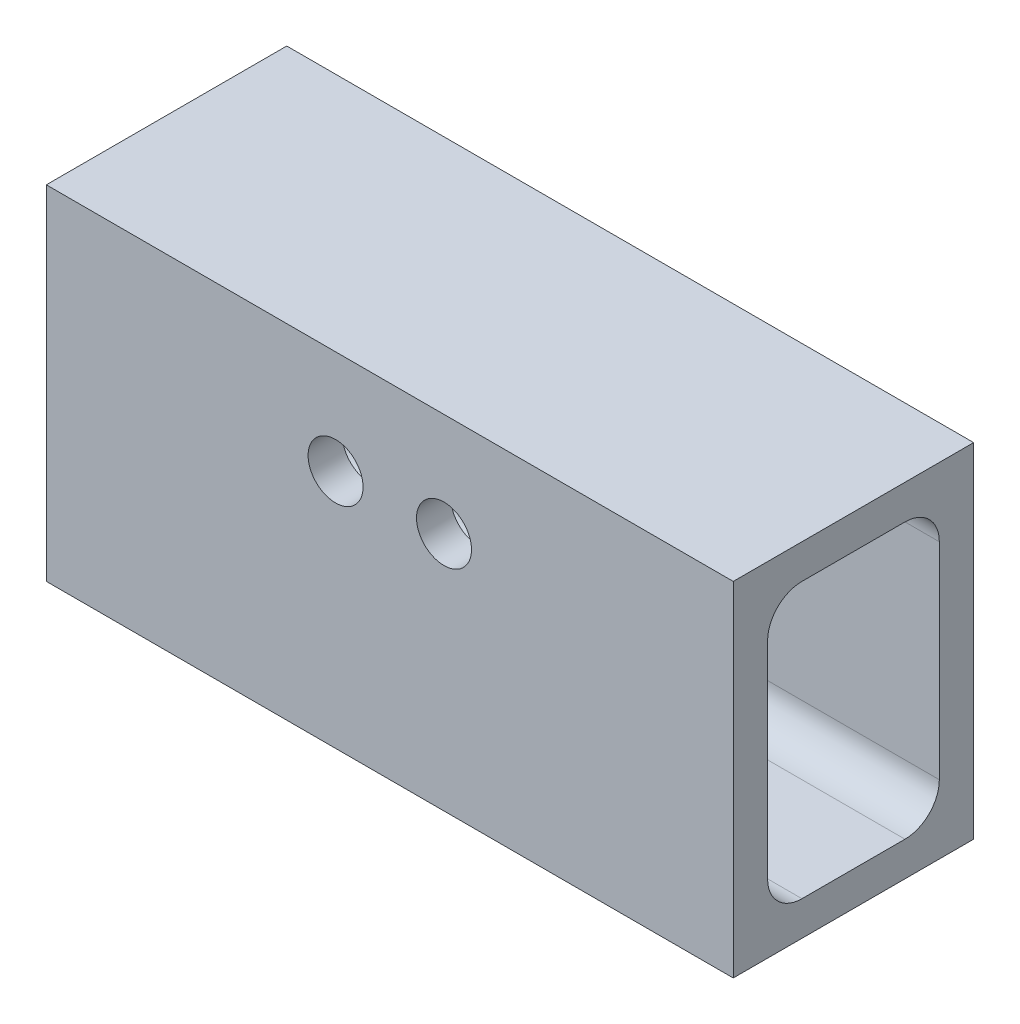
ISO-10303-21;
HEADER;
FILE_DESCRIPTION(('STEP AP214'),'2;1');
FILE_NAME('part.step','',(''),(''),'','','');
FILE_SCHEMA(('AUTOMOTIVE_DESIGN { 1 0 10303 214 1 1 1 1 }'));
ENDSEC;
DATA;
#1=APPLICATION_CONTEXT('core data for automotive mechanical design processes');
#2=APPLICATION_PROTOCOL_DEFINITION('international standard','automotive_design',2000,#1);
#3=PRODUCT_CONTEXT('',#1,'mechanical');
#4=PRODUCT('Part','Part','',(#3));
#5=PRODUCT_RELATED_PRODUCT_CATEGORY('part','',(#4));
#6=PRODUCT_DEFINITION_FORMATION('','',#4);
#7=PRODUCT_DEFINITION_CONTEXT('part definition',#1,'design');
#8=PRODUCT_DEFINITION('design','',#6,#7);
#9=PRODUCT_DEFINITION_SHAPE('','',#8);
#10=(LENGTH_UNIT() NAMED_UNIT(*) SI_UNIT(.MILLI.,.METRE.));
#11=(NAMED_UNIT(*) PLANE_ANGLE_UNIT() SI_UNIT($,.RADIAN.));
#12=(NAMED_UNIT(*) SI_UNIT($,.STERADIAN.) SOLID_ANGLE_UNIT());
#13=UNCERTAINTY_MEASURE_WITH_UNIT(LENGTH_MEASURE(1.E-05),#10,'distance_accuracy_value','');
#14=(GEOMETRIC_REPRESENTATION_CONTEXT(3) GLOBAL_UNCERTAINTY_ASSIGNED_CONTEXT((#13)) GLOBAL_UNIT_ASSIGNED_CONTEXT((#10,
#11,#12)) REPRESENTATION_CONTEXT('',''));
#15=CARTESIAN_POINT('',(0.,0.,0.));
#16=DIRECTION('',(0.,0.,1.));
#17=DIRECTION('',(1.,0.,0.));
#18=AXIS2_PLACEMENT_3D('',#15,#16,#17);
#19=CARTESIAN_POINT('',(9.84311629413669,0.0508823875396415,18.5412850449169));
#20=DIRECTION('',(1.,0.,0.));
#21=DIRECTION('',(0.,1.,0.));
#22=AXIS2_PLACEMENT_3D('',#19,#20,#21);
#23=CYLINDRICAL_SURFACE('',#22,0.75);
#24=DIRECTION('',(-1.,0.,0.));
#25=VECTOR('',#24,1.);
#26=CARTESIAN_POINT('',(9.84311629413669,0.0508823875396415,19.2912850449169));
#27=LINE('',#26,#25);
#28=CARTESIAN_POINT('',(9.84311629413669,0.0508823875396415,19.2912850449169));
#29=VERTEX_POINT('',#28);
#30=CARTESIAN_POINT('',(-5.15688370586331,0.0508823875396394,19.2912850449169));
#31=VERTEX_POINT('',#30);
#32=EDGE_CURVE('E184',#29,#31,#27,.T.);
#33=ORIENTED_EDGE('',*,*,#32,.F.);
#34=CARTESIAN_POINT('',(9.84311629413668,0.0508823875396415,18.5412850449169));
#35=DIRECTION('',(-1.,0.,0.));
#36=DIRECTION('',(0.,-1.,0.));
#37=AXIS2_PLACEMENT_3D('',#34,#35,#36);
#38=CIRCLE('',#37,0.75);
#39=CARTESIAN_POINT('',(9.84311629413669,-0.699117612460358,18.5412850449169));
#40=VERTEX_POINT('',#39);
#41=EDGE_CURVE('E43',#29,#40,#38,.F.);
#42=ORIENTED_EDGE('',*,*,#41,.T.);
#43=DIRECTION('',(-1.,0.,0.));
#44=VECTOR('',#43,1.);
#45=CARTESIAN_POINT('',(9.84311629413669,-0.699117612460358,18.5412850449169));
#46=LINE('',#45,#44);
#47=CARTESIAN_POINT('',(-5.15688370586331,-0.69911761246036,18.5412850449169));
#48=VERTEX_POINT('',#47);
#49=EDGE_CURVE('E187',#48,#40,#46,.F.);
#50=ORIENTED_EDGE('',*,*,#49,.F.);
#51=CARTESIAN_POINT('',(-5.15688370586331,0.0508823875396394,18.5412850449169));
#52=DIRECTION('',(1.,0.,0.));
#53=DIRECTION('',(0.,1.,0.));
#54=AXIS2_PLACEMENT_3D('',#51,#52,#53);
#55=CIRCLE('',#54,0.75);
#56=EDGE_CURVE('E11',#48,#31,#55,.F.);
#57=ORIENTED_EDGE('',*,*,#56,.T.);
#58=EDGE_LOOP('',(#33,#42,#50,#57));
#59=FACE_BOUND('',#58,.T.);
#60=ADVANCED_FACE('F36',(#59),#23,.F.);
#61=CARTESIAN_POINT('',(9.84311629413669,0.0508823875396415,16.2912850449169));
#62=DIRECTION('',(-1.,0.,0.));
#63=DIRECTION('',(0.,-1.,0.));
#64=AXIS2_PLACEMENT_3D('',#61,#62,#63);
#65=CYLINDRICAL_SURFACE('',#64,0.75);
#66=DIRECTION('',(1.,0.,0.));
#67=VECTOR('',#66,1.);
#68=CARTESIAN_POINT('',(9.84311629413669,0.0508823875396415,15.5412850449169));
#69=LINE('',#68,#67);
#70=CARTESIAN_POINT('',(-5.15688370586331,0.0508823875396394,15.5412850449169));
#71=VERTEX_POINT('',#70);
#72=CARTESIAN_POINT('',(9.84311629413669,0.0508823875396415,15.5412850449169));
#73=VERTEX_POINT('',#72);
#74=EDGE_CURVE('E174',#71,#73,#69,.T.);
#75=ORIENTED_EDGE('',*,*,#74,.F.);
#76=CARTESIAN_POINT('',(-5.15688370586331,0.0508823875396394,16.2912850449169));
#77=DIRECTION('',(1.,0.,0.));
#78=DIRECTION('',(0.,1.,0.));
#79=AXIS2_PLACEMENT_3D('',#76,#77,#78);
#80=CIRCLE('',#79,0.75);
#81=CARTESIAN_POINT('',(-5.15688370586331,-0.69911761246036,16.2912850449169));
#82=VERTEX_POINT('',#81);
#83=EDGE_CURVE('E180',#71,#82,#80,.F.);
#84=ORIENTED_EDGE('',*,*,#83,.T.);
#85=DIRECTION('',(1.,0.,0.));
#86=VECTOR('',#85,1.);
#87=CARTESIAN_POINT('',(9.84311629413669,-0.699117612460358,16.2912850449169));
#88=LINE('',#87,#86);
#89=CARTESIAN_POINT('',(9.84311629413669,-0.699117612460358,16.2912850449169));
#90=VERTEX_POINT('',#89);
#91=EDGE_CURVE('E177',#90,#82,#88,.F.);
#92=ORIENTED_EDGE('',*,*,#91,.F.);
#93=CARTESIAN_POINT('',(9.84311629413668,0.0508823875396415,16.2912850449169));
#94=DIRECTION('',(-1.,0.,0.));
#95=DIRECTION('',(0.,-1.,0.));
#96=AXIS2_PLACEMENT_3D('',#93,#94,#95);
#97=CIRCLE('',#96,0.75);
#98=EDGE_CURVE('E182',#90,#73,#97,.F.);
#99=ORIENTED_EDGE('',*,*,#98,.T.);
#100=EDGE_LOOP('',(#75,#84,#92,#99));
#101=FACE_BOUND('',#100,.T.);
#102=ADVANCED_FACE('F246',(#101),#65,.F.);
#103=CARTESIAN_POINT('',(9.84311629413669,4.55088238753964,18.5412850449169));
#104=DIRECTION('',(1.,0.,0.));
#105=DIRECTION('',(0.,1.,0.));
#106=AXIS2_PLACEMENT_3D('',#103,#104,#105);
#107=CYLINDRICAL_SURFACE('',#106,0.75);
#108=DIRECTION('',(-1.,0.,0.));
#109=VECTOR('',#108,1.);
#110=CARTESIAN_POINT('',(9.84311629413669,5.30088238753964,18.5412850449169));
#111=LINE('',#110,#109);
#112=CARTESIAN_POINT('',(9.84311629413669,5.30088238753964,18.5412850449169));
#113=VERTEX_POINT('',#112);
#114=CARTESIAN_POINT('',(-5.15688370586331,5.30088238753964,18.5412850449169));
#115=VERTEX_POINT('',#114);
#116=EDGE_CURVE('E163',#113,#115,#111,.T.);
#117=ORIENTED_EDGE('',*,*,#116,.F.);
#118=CARTESIAN_POINT('',(9.84311629413669,4.55088238753964,18.5412850449169));
#119=DIRECTION('',(-1.,0.,0.));
#120=DIRECTION('',(0.,-1.,0.));
#121=AXIS2_PLACEMENT_3D('',#118,#119,#120);
#122=CIRCLE('',#121,0.75);
#123=CARTESIAN_POINT('',(9.84311629413669,4.55088238753964,19.2912850449169));
#124=VERTEX_POINT('',#123);
#125=EDGE_CURVE('E169',#113,#124,#122,.F.);
#126=ORIENTED_EDGE('',*,*,#125,.T.);
#127=DIRECTION('',(-1.,0.,0.));
#128=VECTOR('',#127,1.);
#129=CARTESIAN_POINT('',(9.84311629413669,4.55088238753964,19.2912850449169));
#130=LINE('',#129,#128);
#131=CARTESIAN_POINT('',(-5.15688370586331,4.55088238753964,19.2912850449169));
#132=VERTEX_POINT('',#131);
#133=EDGE_CURVE('E166',#132,#124,#130,.F.);
#134=ORIENTED_EDGE('',*,*,#133,.F.);
#135=CARTESIAN_POINT('',(-5.15688370586331,4.55088238753964,18.5412850449169));
#136=DIRECTION('',(1.,0.,0.));
#137=DIRECTION('',(0.,1.,0.));
#138=AXIS2_PLACEMENT_3D('',#135,#136,#137);
#139=CIRCLE('',#138,0.75);
#140=EDGE_CURVE('E172',#132,#115,#139,.F.);
#141=ORIENTED_EDGE('',*,*,#140,.T.);
#142=EDGE_LOOP('',(#117,#126,#134,#141));
#143=FACE_BOUND('',#142,.T.);
#144=ADVANCED_FACE('F250',(#143),#107,.F.);
#145=CARTESIAN_POINT('',(9.84311629413669,4.55088238753964,16.2912850449169));
#146=DIRECTION('',(-1.,0.,0.));
#147=DIRECTION('',(0.,-1.,0.));
#148=AXIS2_PLACEMENT_3D('',#145,#146,#147);
#149=CYLINDRICAL_SURFACE('',#148,0.75);
#150=DIRECTION('',(1.,0.,0.));
#151=VECTOR('',#150,1.);
#152=CARTESIAN_POINT('',(9.84311629413669,5.30088238753964,16.2912850449169));
#153=LINE('',#152,#151);
#154=CARTESIAN_POINT('',(-5.15688370586331,5.30088238753964,16.2912850449169));
#155=VERTEX_POINT('',#154);
#156=CARTESIAN_POINT('',(9.84311629413669,5.30088238753964,16.2912850449169));
#157=VERTEX_POINT('',#156);
#158=EDGE_CURVE('E147',#155,#157,#153,.T.);
#159=ORIENTED_EDGE('',*,*,#158,.F.);
#160=CARTESIAN_POINT('',(-5.15688370586331,4.55088238753964,16.2912850449169));
#161=DIRECTION('',(1.,0.,0.));
#162=DIRECTION('',(0.,1.,0.));
#163=AXIS2_PLACEMENT_3D('',#160,#161,#162);
#164=CIRCLE('',#163,0.75);
#165=CARTESIAN_POINT('',(-5.15688370586331,4.55088238753964,15.5412850449169));
#166=VERTEX_POINT('',#165);
#167=EDGE_CURVE('E158',#155,#166,#164,.F.);
#168=ORIENTED_EDGE('',*,*,#167,.T.);
#169=DIRECTION('',(1.,0.,0.));
#170=VECTOR('',#169,1.);
#171=CARTESIAN_POINT('',(9.84311629413669,4.55088238753964,15.5412850449169));
#172=LINE('',#171,#170);
#173=CARTESIAN_POINT('',(9.84311629413669,4.55088238753964,15.5412850449169));
#174=VERTEX_POINT('',#173);
#175=EDGE_CURVE('E150',#174,#166,#172,.F.);
#176=ORIENTED_EDGE('',*,*,#175,.F.);
#177=CARTESIAN_POINT('',(9.84311629413669,4.55088238753964,16.2912850449169));
#178=DIRECTION('',(-1.,0.,0.));
#179=DIRECTION('',(0.,-1.,0.));
#180=AXIS2_PLACEMENT_3D('',#177,#178,#179);
#181=CIRCLE('',#180,0.75);
#182=EDGE_CURVE('E160',#174,#157,#181,.F.);
#183=ORIENTED_EDGE('',*,*,#182,.T.);
#184=EDGE_LOOP('',(#159,#168,#176,#183));
#185=FACE_BOUND('',#184,.T.);
#186=ADVANCED_FACE('F266',(#185),#149,.F.);
#187=CARTESIAN_POINT('',(-5.15688370586331,6.05088238753964,20.0412850449169));
#188=DIRECTION('',(1.,0.,0.));
#189=DIRECTION('',(0.,1.,0.));
#190=AXIS2_PLACEMENT_3D('',#187,#188,#189);
#191=PLANE('',#190);
#192=DIRECTION('',(0.,1.,0.));
#193=VECTOR('',#192,1.);
#194=CARTESIAN_POINT('',(-5.15688370586331,5.30088238753964,19.2912850449169));
#195=LINE('',#194,#193);
#196=EDGE_CURVE('E216',#31,#132,#195,.T.);
#197=ORIENTED_EDGE('',*,*,#196,.F.);
#198=ORIENTED_EDGE('',*,*,#56,.F.);
#199=DIRECTION('',(0.,0.,1.));
#200=VECTOR('',#199,1.);
#201=CARTESIAN_POINT('',(-5.15688370586331,-0.69911761246036,15.5412850449169));
#202=LINE('',#201,#200);
#203=EDGE_CURVE('E194',#82,#48,#202,.T.);
#204=ORIENTED_EDGE('',*,*,#203,.F.);
#205=ORIENTED_EDGE('',*,*,#83,.F.);
#206=DIRECTION('',(0.,-1.,0.));
#207=VECTOR('',#206,1.);
#208=CARTESIAN_POINT('',(-5.15688370586331,5.30088238753964,15.5412850449169));
#209=LINE('',#208,#207);
#210=EDGE_CURVE('E201',#166,#71,#209,.T.);
#211=ORIENTED_EDGE('',*,*,#210,.F.);
#212=ORIENTED_EDGE('',*,*,#167,.F.);
#213=DIRECTION('',(0.,0.,-1.));
#214=VECTOR('',#213,1.);
#215=CARTESIAN_POINT('',(-5.15688370586331,5.30088238753964,15.5412850449169));
#216=LINE('',#215,#214);
#217=EDGE_CURVE('E206',#115,#155,#216,.T.);
#218=ORIENTED_EDGE('',*,*,#217,.F.);
#219=ORIENTED_EDGE('',*,*,#140,.F.);
#220=EDGE_LOOP('',(#197,#198,#204,#205,#211,#212,#218,#219));
#221=FACE_BOUND('',#220,.T.);
#222=DIRECTION('',(0.,-1.,0.));
#223=VECTOR('',#222,1.);
#224=CARTESIAN_POINT('',(-5.15688370586331,6.05088238753964,14.7912850449169));
#225=LINE('',#224,#223);
#226=CARTESIAN_POINT('',(-5.15688370586331,6.05088238753964,14.7912850449169));
#227=VERTEX_POINT('',#226);
#228=CARTESIAN_POINT('',(-5.15688370586331,-1.44911761246036,14.7912850449169));
#229=VERTEX_POINT('',#228);
#230=EDGE_CURVE('E146',#227,#229,#225,.T.);
#231=ORIENTED_EDGE('',*,*,#230,.T.);
#232=DIRECTION('',(0.,0.,-1.));
#233=VECTOR('',#232,1.);
#234=CARTESIAN_POINT('',(-5.15688370586331,-1.44911761246036,20.0412850449169));
#235=LINE('',#234,#233);
#236=CARTESIAN_POINT('',(-5.15688370586331,-1.44911761246036,20.0412850449169));
#237=VERTEX_POINT('',#236);
#238=EDGE_CURVE('E126',#237,#229,#235,.T.);
#239=ORIENTED_EDGE('',*,*,#238,.F.);
#240=DIRECTION('',(0.,-1.,0.));
#241=VECTOR('',#240,1.);
#242=CARTESIAN_POINT('',(-5.15688370586331,6.05088238753964,20.0412850449169));
#243=LINE('',#242,#241);
#244=CARTESIAN_POINT('',(-5.15688370586331,6.05088238753964,20.0412850449169));
#245=VERTEX_POINT('',#244);
#246=EDGE_CURVE('E133',#245,#237,#243,.T.);
#247=ORIENTED_EDGE('',*,*,#246,.F.);
#248=DIRECTION('',(0.,0.,-1.));
#249=VECTOR('',#248,1.);
#250=CARTESIAN_POINT('',(-5.15688370586331,6.05088238753964,20.0412850449169));
#251=LINE('',#250,#249);
#252=EDGE_CURVE('E222',#245,#227,#251,.T.);
#253=ORIENTED_EDGE('',*,*,#252,.T.);
#254=EDGE_LOOP('',(#231,#239,#247,#253));
#255=FACE_BOUND('',#254,.T.);
#256=ADVANCED_FACE('F144',(#221,#255),#191,.F.);
#257=CARTESIAN_POINT('',(-5.15688370586331,-1.44911761246036,20.0412850449169));
#258=DIRECTION('',(0.,1.,0.));
#259=DIRECTION('',(0.,0.,1.));
#260=AXIS2_PLACEMENT_3D('',#257,#258,#259);
#261=PLANE('',#260);
#262=DIRECTION('',(1.,0.,0.));
#263=VECTOR('',#262,1.);
#264=CARTESIAN_POINT('',(-5.15688370586331,-1.44911761246036,14.7912850449169));
#265=LINE('',#264,#263);
#266=CARTESIAN_POINT('',(9.84311629413668,-1.44911761246036,14.7912850449169));
#267=VERTEX_POINT('',#266);
#268=EDGE_CURVE('E224',#229,#267,#265,.T.);
#269=ORIENTED_EDGE('',*,*,#268,.T.);
#270=DIRECTION('',(0.,0.,-1.));
#271=VECTOR('',#270,1.);
#272=CARTESIAN_POINT('',(9.84311629413668,-1.44911761246036,20.0412850449169));
#273=LINE('',#272,#271);
#274=CARTESIAN_POINT('',(9.84311629413668,-1.44911761246036,20.0412850449169));
#275=VERTEX_POINT('',#274);
#276=EDGE_CURVE('E129',#275,#267,#273,.T.);
#277=ORIENTED_EDGE('',*,*,#276,.F.);
#278=DIRECTION('',(1.,0.,0.));
#279=VECTOR('',#278,1.);
#280=CARTESIAN_POINT('',(-5.15688370586331,-1.44911761246036,20.0412850449169));
#281=LINE('',#280,#279);
#282=EDGE_CURVE('E122',#237,#275,#281,.T.);
#283=ORIENTED_EDGE('',*,*,#282,.F.);
#284=ORIENTED_EDGE('',*,*,#238,.T.);
#285=EDGE_LOOP('',(#269,#277,#283,#284));
#286=FACE_BOUND('',#285,.T.);
#287=ADVANCED_FACE('F124',(#286),#261,.F.);
#288=CARTESIAN_POINT('',(9.84311629413669,6.05088238753964,20.0412850449169));
#289=DIRECTION('',(-1.,0.,0.));
#290=DIRECTION('',(0.,-1.,0.));
#291=AXIS2_PLACEMENT_3D('',#288,#289,#290);
#292=PLANE('',#291);
#293=ORIENTED_EDGE('',*,*,#41,.F.);
#294=DIRECTION('',(0.,1.,0.));
#295=VECTOR('',#294,1.);
#296=CARTESIAN_POINT('',(9.84311629413669,5.30088238753964,19.2912850449169));
#297=LINE('',#296,#295);
#298=EDGE_CURVE('E200',#29,#124,#297,.T.);
#299=ORIENTED_EDGE('',*,*,#298,.T.);
#300=ORIENTED_EDGE('',*,*,#125,.F.);
#301=DIRECTION('',(0.,0.,-1.));
#302=VECTOR('',#301,1.);
#303=CARTESIAN_POINT('',(9.84311629413669,5.30088238753964,15.5412850449169));
#304=LINE('',#303,#302);
#305=EDGE_CURVE('E203',#113,#157,#304,.T.);
#306=ORIENTED_EDGE('',*,*,#305,.T.);
#307=ORIENTED_EDGE('',*,*,#182,.F.);
#308=DIRECTION('',(0.,-1.,0.));
#309=VECTOR('',#308,1.);
#310=CARTESIAN_POINT('',(9.84311629413669,5.30088238753964,15.5412850449169));
#311=LINE('',#310,#309);
#312=EDGE_CURVE('E213',#174,#73,#311,.T.);
#313=ORIENTED_EDGE('',*,*,#312,.T.);
#314=ORIENTED_EDGE('',*,*,#98,.F.);
#315=DIRECTION('',(0.,0.,1.));
#316=VECTOR('',#315,1.);
#317=CARTESIAN_POINT('',(9.84311629413669,-0.699117612460358,15.5412850449169));
#318=LINE('',#317,#316);
#319=EDGE_CURVE('E193',#90,#40,#318,.T.);
#320=ORIENTED_EDGE('',*,*,#319,.T.);
#321=EDGE_LOOP('',(#293,#299,#300,#306,#307,#313,#314,#320));
#322=FACE_BOUND('',#321,.T.);
#323=DIRECTION('',(0.,1.,0.));
#324=VECTOR('',#323,1.);
#325=CARTESIAN_POINT('',(9.84311629413669,6.05088238753964,14.7912850449169));
#326=LINE('',#325,#324);
#327=CARTESIAN_POINT('',(9.84311629413669,6.05088238753964,14.7912850449169));
#328=VERTEX_POINT('',#327);
#329=EDGE_CURVE('E226',#267,#328,#326,.T.);
#330=ORIENTED_EDGE('',*,*,#329,.T.);
#331=DIRECTION('',(0.,0.,-1.));
#332=VECTOR('',#331,1.);
#333=CARTESIAN_POINT('',(9.84311629413669,6.05088238753964,20.0412850449169));
#334=LINE('',#333,#332);
#335=CARTESIAN_POINT('',(9.84311629413669,6.05088238753964,20.0412850449169));
#336=VERTEX_POINT('',#335);
#337=EDGE_CURVE('E152',#336,#328,#334,.T.);
#338=ORIENTED_EDGE('',*,*,#337,.F.);
#339=DIRECTION('',(0.,1.,0.));
#340=VECTOR('',#339,1.);
#341=CARTESIAN_POINT('',(9.84311629413669,6.05088238753964,20.0412850449169));
#342=LINE('',#341,#340);
#343=EDGE_CURVE('E132',#275,#336,#342,.T.);
#344=ORIENTED_EDGE('',*,*,#343,.F.);
#345=ORIENTED_EDGE('',*,*,#276,.T.);
#346=EDGE_LOOP('',(#330,#338,#344,#345));
#347=FACE_BOUND('',#346,.T.);
#348=ADVANCED_FACE('F196',(#322,#347),#292,.F.);
#349=CARTESIAN_POINT('',(-5.15688370586331,6.05088238753964,20.0412850449169));
#350=DIRECTION('',(0.,-1.,0.));
#351=DIRECTION('',(0.,0.,-1.));
#352=AXIS2_PLACEMENT_3D('',#349,#350,#351);
#353=PLANE('',#352);
#354=DIRECTION('',(-1.,0.,0.));
#355=VECTOR('',#354,1.);
#356=CARTESIAN_POINT('',(-5.15688370586331,6.05088238753964,14.7912850449169));
#357=LINE('',#356,#355);
#358=EDGE_CURVE('E142',#328,#227,#357,.T.);
#359=ORIENTED_EDGE('',*,*,#358,.T.);
#360=ORIENTED_EDGE('',*,*,#252,.F.);
#361=DIRECTION('',(-1.,0.,0.));
#362=VECTOR('',#361,1.);
#363=CARTESIAN_POINT('',(-5.15688370586331,6.05088238753964,20.0412850449169));
#364=LINE('',#363,#362);
#365=EDGE_CURVE('E138',#336,#245,#364,.T.);
#366=ORIENTED_EDGE('',*,*,#365,.F.);
#367=ORIENTED_EDGE('',*,*,#337,.T.);
#368=EDGE_LOOP('',(#359,#360,#366,#367));
#369=FACE_BOUND('',#368,.T.);
#370=ADVANCED_FACE('F233',(#369),#353,.F.);
#371=CARTESIAN_POINT('',(1.99164885001618,1.94742271795752,20.0412850449169));
#372=DIRECTION('',(0.,0.,1.));
#373=DIRECTION('',(1.,0.,0.));
#374=AXIS2_PLACEMENT_3D('',#371,#372,#373);
#375=PLANE('',#374);
#376=CARTESIAN_POINT('',(1.15908771401669,3.79296551227584,20.0412850449169));
#377=DIRECTION('',(0.,0.,1.));
#378=DIRECTION('',(1.,0.,0.));
#379=AXIS2_PLACEMENT_3D('',#376,#377,#378);
#380=CIRCLE('',#379,0.600341561629071);
#381=CARTESIAN_POINT('',(1.75942927564576,3.79296551227584,20.0412850449169));
#382=VERTEX_POINT('',#381);
#383=EDGE_CURVE('E397',#382,#382,#380,.T.);
#384=ORIENTED_EDGE('',*,*,#383,.F.);
#385=EDGE_LOOP('',(#384));
#386=FACE_BOUND('',#385,.T.);
#387=CARTESIAN_POINT('',(3.52714487425669,3.79296551227584,20.0412850449169));
#388=DIRECTION('',(0.,0.,1.));
#389=DIRECTION('',(-1.,0.,0.));
#390=AXIS2_PLACEMENT_3D('',#387,#388,#389);
#391=CIRCLE('',#390,0.600341561629071);
#392=CARTESIAN_POINT('',(2.92680331262762,3.79296551227584,20.0412850449169));
#393=VERTEX_POINT('',#392);
#394=EDGE_CURVE('E209',#393,#393,#391,.T.);
#395=ORIENTED_EDGE('',*,*,#394,.F.);
#396=EDGE_LOOP('',(#395));
#397=FACE_BOUND('',#396,.T.);
#398=ORIENTED_EDGE('',*,*,#246,.T.);
#399=ORIENTED_EDGE('',*,*,#282,.T.);
#400=ORIENTED_EDGE('',*,*,#343,.T.);
#401=ORIENTED_EDGE('',*,*,#365,.T.);
#402=EDGE_LOOP('',(#398,#399,#400,#401));
#403=FACE_BOUND('',#402,.T.);
#404=ADVANCED_FACE('F136',(#386,#397,#403),#375,.T.);
#405=CARTESIAN_POINT('',(1.99164885001618,1.94742271795752,14.7912850449169));
#406=DIRECTION('',(0.,0.,1.));
#407=DIRECTION('',(1.,0.,0.));
#408=AXIS2_PLACEMENT_3D('',#405,#406,#407);
#409=PLANE('',#408);
#410=ORIENTED_EDGE('',*,*,#230,.F.);
#411=ORIENTED_EDGE('',*,*,#358,.F.);
#412=ORIENTED_EDGE('',*,*,#329,.F.);
#413=ORIENTED_EDGE('',*,*,#268,.F.);
#414=EDGE_LOOP('',(#410,#411,#412,#413));
#415=FACE_BOUND('',#414,.T.);
#416=ADVANCED_FACE('F236',(#415),#409,.F.);
#417=CARTESIAN_POINT('',(9.84311629413669,-0.699117612460358,15.5412850449169));
#418=DIRECTION('',(0.,-1.,0.));
#419=DIRECTION('',(1.,0.,0.));
#420=AXIS2_PLACEMENT_3D('',#417,#418,#419);
#421=PLANE('',#420);
#422=ORIENTED_EDGE('',*,*,#203,.T.);
#423=ORIENTED_EDGE('',*,*,#49,.T.);
#424=ORIENTED_EDGE('',*,*,#319,.F.);
#425=ORIENTED_EDGE('',*,*,#91,.T.);
#426=EDGE_LOOP('',(#422,#423,#424,#425));
#427=FACE_BOUND('',#426,.T.);
#428=ADVANCED_FACE('F192',(#427),#421,.F.);
#429=CARTESIAN_POINT('',(9.84311629413669,5.30088238753964,15.5412850449169));
#430=DIRECTION('',(0.,0.,-1.));
#431=DIRECTION('',(-1.,0.,0.));
#432=AXIS2_PLACEMENT_3D('',#429,#430,#431);
#433=PLANE('',#432);
#434=ORIENTED_EDGE('',*,*,#210,.T.);
#435=ORIENTED_EDGE('',*,*,#74,.T.);
#436=ORIENTED_EDGE('',*,*,#312,.F.);
#437=ORIENTED_EDGE('',*,*,#175,.T.);
#438=EDGE_LOOP('',(#434,#435,#436,#437));
#439=FACE_BOUND('',#438,.T.);
#440=ADVANCED_FACE('F271',(#439),#433,.F.);
#441=CARTESIAN_POINT('',(9.84311629413669,5.30088238753964,15.5412850449169));
#442=DIRECTION('',(0.,1.,0.));
#443=DIRECTION('',(-1.,0.,0.));
#444=AXIS2_PLACEMENT_3D('',#441,#442,#443);
#445=PLANE('',#444);
#446=ORIENTED_EDGE('',*,*,#305,.F.);
#447=ORIENTED_EDGE('',*,*,#116,.T.);
#448=ORIENTED_EDGE('',*,*,#217,.T.);
#449=ORIENTED_EDGE('',*,*,#158,.T.);
#450=EDGE_LOOP('',(#446,#447,#448,#449));
#451=FACE_BOUND('',#450,.T.);
#452=ADVANCED_FACE('F262',(#451),#445,.F.);
#453=CARTESIAN_POINT('',(9.84311629413669,5.30088238753964,19.2912850449169));
#454=DIRECTION('',(0.,0.,1.));
#455=DIRECTION('',(1.,0.,0.));
#456=AXIS2_PLACEMENT_3D('',#453,#454,#455);
#457=PLANE('',#456);
#458=CARTESIAN_POINT('',(1.15908771401669,3.79296551227584,19.2912850449169));
#459=DIRECTION('',(0.,0.,1.));
#460=DIRECTION('',(1.,0.,0.));
#461=AXIS2_PLACEMENT_3D('',#458,#459,#460);
#462=CIRCLE('',#461,0.600341561629071);
#463=CARTESIAN_POINT('',(1.75942927564576,3.79296551227584,19.2912850449169));
#464=VERTEX_POINT('',#463);
#465=EDGE_CURVE('E217',#464,#464,#462,.T.);
#466=ORIENTED_EDGE('',*,*,#465,.T.);
#467=EDGE_LOOP('',(#466));
#468=FACE_BOUND('',#467,.T.);
#469=CARTESIAN_POINT('',(3.52714487425669,3.79296551227584,19.2912850449169));
#470=DIRECTION('',(0.,0.,1.));
#471=DIRECTION('',(-1.,0.,0.));
#472=AXIS2_PLACEMENT_3D('',#469,#470,#471);
#473=CIRCLE('',#472,0.600341561629071);
#474=CARTESIAN_POINT('',(2.92680331262762,3.79296551227584,19.2912850449169));
#475=VERTEX_POINT('',#474);
#476=EDGE_CURVE('E398',#475,#475,#473,.T.);
#477=ORIENTED_EDGE('',*,*,#476,.T.);
#478=EDGE_LOOP('',(#477));
#479=FACE_BOUND('',#478,.T.);
#480=ORIENTED_EDGE('',*,*,#298,.F.);
#481=ORIENTED_EDGE('',*,*,#32,.T.);
#482=ORIENTED_EDGE('',*,*,#196,.T.);
#483=ORIENTED_EDGE('',*,*,#133,.T.);
#484=EDGE_LOOP('',(#480,#481,#482,#483));
#485=FACE_BOUND('',#484,.T.);
#486=ADVANCED_FACE('F254',(#468,#479,#485),#457,.F.);
#487=CARTESIAN_POINT('',(3.52714487425669,3.79296551227584,19.2912850449169));
#488=DIRECTION('',(0.,0.,1.));
#489=DIRECTION('',(1.,0.,0.));
#490=AXIS2_PLACEMENT_3D('',#487,#488,#489);
#491=CYLINDRICAL_SURFACE('',#490,0.600341561629071);
#492=ORIENTED_EDGE('',*,*,#476,.F.);
#493=EDGE_LOOP('',(#492));
#494=FACE_BOUND('',#493,.T.);
#495=ORIENTED_EDGE('',*,*,#394,.T.);
#496=EDGE_LOOP('',(#495));
#497=FACE_BOUND('',#496,.T.);
#498=ADVANCED_FACE('F364',(#494,#497),#491,.F.);
#499=CARTESIAN_POINT('',(1.15908771401669,3.79296551227584,19.2912850449169));
#500=DIRECTION('',(0.,0.,1.));
#501=DIRECTION('',(1.,0.,0.));
#502=AXIS2_PLACEMENT_3D('',#499,#500,#501);
#503=CYLINDRICAL_SURFACE('',#502,0.600341561629071);
#504=ORIENTED_EDGE('',*,*,#465,.F.);
#505=EDGE_LOOP('',(#504));
#506=FACE_BOUND('',#505,.T.);
#507=ORIENTED_EDGE('',*,*,#383,.T.);
#508=EDGE_LOOP('',(#507));
#509=FACE_BOUND('',#508,.T.);
#510=ADVANCED_FACE('F372',(#506,#509),#503,.F.);
#511=CLOSED_SHELL('',(#60,#102,#144,#186,#256,#287,#348,#370,#404,#416,#428,#440,#452,#486,#498,#510));
#512=MANIFOLD_SOLID_BREP('B2',#511);
#513=ADVANCED_BREP_SHAPE_REPRESENTATION('',(#18,#512),#14);
#514=SHAPE_DEFINITION_REPRESENTATION(#9,#513);
ENDSEC;
END-ISO-10303-21;
